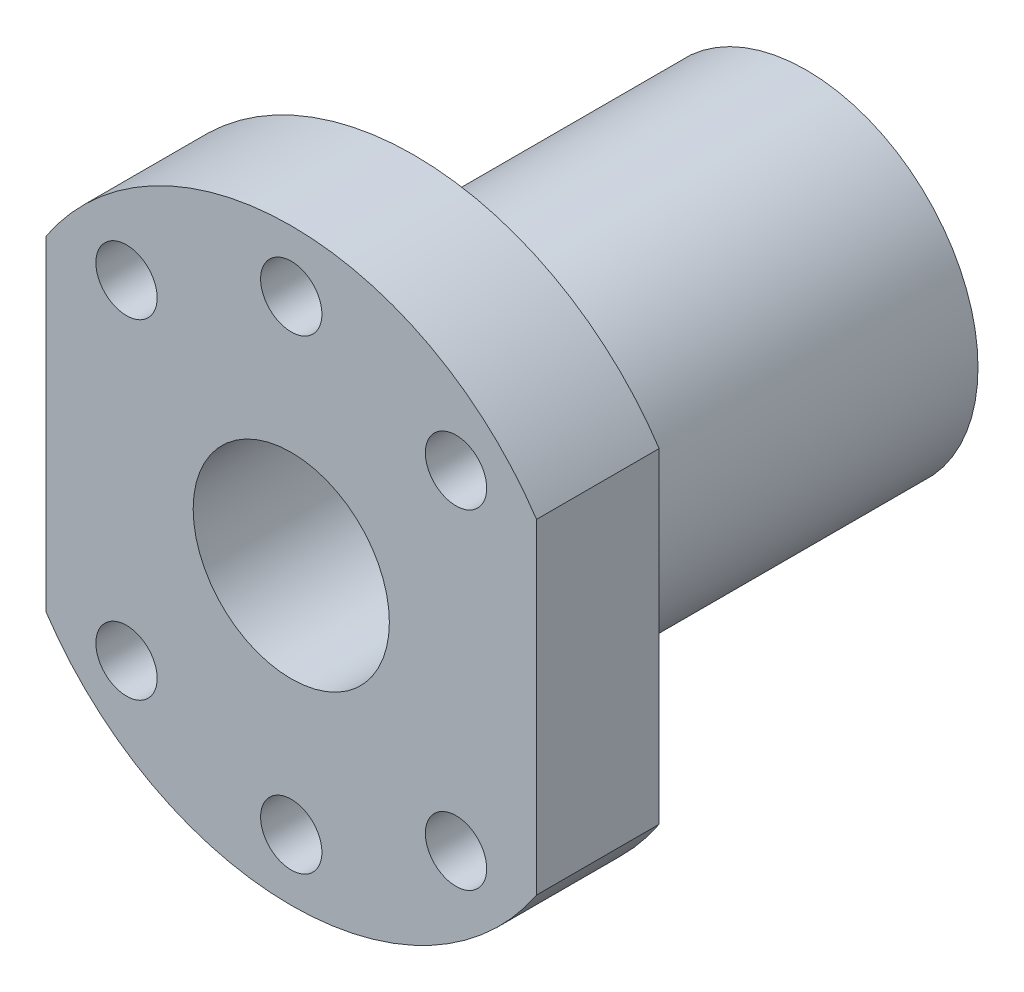
ISO-10303-21;
HEADER;
FILE_DESCRIPTION(('STEP AP214'),'2;1');
FILE_NAME('part.step','',(''),(''),'','','');
FILE_SCHEMA(('AUTOMOTIVE_DESIGN { 1 0 10303 214 1 1 1 1 }'));
ENDSEC;
DATA;
#1=APPLICATION_CONTEXT('core data for automotive mechanical design processes');
#2=APPLICATION_PROTOCOL_DEFINITION('international standard','automotive_design',2000,#1);
#3=PRODUCT_CONTEXT('',#1,'mechanical');
#4=PRODUCT('Part','Part','',(#3));
#5=PRODUCT_RELATED_PRODUCT_CATEGORY('part','',(#4));
#6=PRODUCT_DEFINITION_FORMATION('','',#4);
#7=PRODUCT_DEFINITION_CONTEXT('part definition',#1,'design');
#8=PRODUCT_DEFINITION('design','',#6,#7);
#9=PRODUCT_DEFINITION_SHAPE('','',#8);
#10=(LENGTH_UNIT() NAMED_UNIT(*) SI_UNIT(.MILLI.,.METRE.));
#11=(NAMED_UNIT(*) PLANE_ANGLE_UNIT() SI_UNIT($,.RADIAN.));
#12=(NAMED_UNIT(*) SI_UNIT($,.STERADIAN.) SOLID_ANGLE_UNIT());
#13=UNCERTAINTY_MEASURE_WITH_UNIT(LENGTH_MEASURE(1.E-05),#10,'distance_accuracy_value','');
#14=(GEOMETRIC_REPRESENTATION_CONTEXT(3) GLOBAL_UNCERTAINTY_ASSIGNED_CONTEXT((#13)) GLOBAL_UNIT_ASSIGNED_CONTEXT((#10,
#11,#12)) REPRESENTATION_CONTEXT('',''));
#15=CARTESIAN_POINT('',(0.,0.,0.));
#16=DIRECTION('',(0.,0.,1.));
#17=DIRECTION('',(1.,0.,0.));
#18=AXIS2_PLACEMENT_3D('',#15,#16,#17);
#19=CARTESIAN_POINT('',(0.,0.,0.));
#20=DIRECTION('',(0.,0.,1.));
#21=DIRECTION('',(1.,0.,0.));
#22=AXIS2_PLACEMENT_3D('',#19,#20,#21);
#23=PLANE('',#22);
#24=CARTESIAN_POINT('',(-13.4350288425442,13.4350288425446,0.));
#25=DIRECTION('',(0.,0.,1.));
#26=DIRECTION('',(1.,0.,0.));
#27=AXIS2_PLACEMENT_3D('',#24,#25,#26);
#28=CIRCLE('',#27,2.49999999999999);
#29=CARTESIAN_POINT('',(-10.9350288425442,13.4350288425446,0.));
#30=VERTEX_POINT('',#29);
#31=EDGE_CURVE('E265',#30,#30,#28,.T.);
#32=ORIENTED_EDGE('',*,*,#31,.T.);
#33=EDGE_LOOP('',(#32));
#34=FACE_BOUND('',#33,.T.);
#35=CARTESIAN_POINT('',(-13.4350288425445,-13.4350288425443,0.));
#36=DIRECTION('',(0.,0.,1.));
#37=DIRECTION('',(1.,0.,0.));
#38=AXIS2_PLACEMENT_3D('',#35,#36,#37);
#39=CIRCLE('',#38,2.49999999999999);
#40=CARTESIAN_POINT('',(-10.9350288425445,-13.4350288425443,0.));
#41=VERTEX_POINT('',#40);
#42=EDGE_CURVE('E259',#41,#41,#39,.T.);
#43=ORIENTED_EDGE('',*,*,#42,.T.);
#44=EDGE_LOOP('',(#43));
#45=FACE_BOUND('',#44,.T.);
#46=CARTESIAN_POINT('',(0.,-19.,0.));
#47=DIRECTION('',(0.,0.,1.));
#48=DIRECTION('',(1.,0.,0.));
#49=AXIS2_PLACEMENT_3D('',#46,#47,#48);
#50=CIRCLE('',#49,2.49999999999999);
#51=CARTESIAN_POINT('',(2.49999999999999,-19.,0.));
#52=VERTEX_POINT('',#51);
#53=EDGE_CURVE('E253',#52,#52,#50,.T.);
#54=ORIENTED_EDGE('',*,*,#53,.T.);
#55=EDGE_LOOP('',(#54));
#56=FACE_BOUND('',#55,.T.);
#57=CARTESIAN_POINT('',(13.4350288425443,-13.4350288425445,0.));
#58=DIRECTION('',(0.,0.,1.));
#59=DIRECTION('',(1.,0.,0.));
#60=AXIS2_PLACEMENT_3D('',#57,#58,#59);
#61=CIRCLE('',#60,2.49999999999999);
#62=CARTESIAN_POINT('',(15.9350288425443,-13.4350288425445,0.));
#63=VERTEX_POINT('',#62);
#64=EDGE_CURVE('E37',#63,#63,#61,.T.);
#65=ORIENTED_EDGE('',*,*,#64,.T.);
#66=EDGE_LOOP('',(#65));
#67=FACE_BOUND('',#66,.T.);
#68=CARTESIAN_POINT('',(13.4350288425444,13.4350288425444,0.));
#69=DIRECTION('',(0.,0.,1.));
#70=DIRECTION('',(1.,0.,0.));
#71=AXIS2_PLACEMENT_3D('',#68,#69,#70);
#72=CIRCLE('',#71,2.49999999999999);
#73=CARTESIAN_POINT('',(15.9350288425444,13.4350288425444,0.));
#74=VERTEX_POINT('',#73);
#75=EDGE_CURVE('E244',#74,#74,#72,.T.);
#76=ORIENTED_EDGE('',*,*,#75,.T.);
#77=EDGE_LOOP('',(#76));
#78=FACE_BOUND('',#77,.T.);
#79=CARTESIAN_POINT('',(0.,19.,0.));
#80=DIRECTION('',(0.,0.,1.));
#81=DIRECTION('',(1.,0.,0.));
#82=AXIS2_PLACEMENT_3D('',#79,#80,#81);
#83=CIRCLE('',#82,2.49999999999999);
#84=CARTESIAN_POINT('',(2.49999999999999,19.,0.));
#85=VERTEX_POINT('',#84);
#86=EDGE_CURVE('E232',#85,#85,#83,.T.);
#87=ORIENTED_EDGE('',*,*,#86,.T.);
#88=EDGE_LOOP('',(#87));
#89=FACE_BOUND('',#88,.T.);
#90=CARTESIAN_POINT('',(0.,0.,0.));
#91=DIRECTION('',(0.,0.,1.));
#92=DIRECTION('',(1.,0.,0.));
#93=AXIS2_PLACEMENT_3D('',#90,#91,#92);
#94=CIRCLE('',#93,24.);
#95=CARTESIAN_POINT('',(-20.,-13.2664991614216,0.));
#96=VERTEX_POINT('',#95);
#97=CARTESIAN_POINT('',(20.,-13.2664991614216,0.));
#98=VERTEX_POINT('',#97);
#99=EDGE_CURVE('E101',#96,#98,#94,.T.);
#100=ORIENTED_EDGE('',*,*,#99,.F.);
#101=DIRECTION('',(0.,-1.,0.));
#102=VECTOR('',#101,1.);
#103=CARTESIAN_POINT('',(-20.,13.2664991614216,0.));
#104=LINE('',#103,#102);
#105=CARTESIAN_POINT('',(-20.,13.2664991614216,0.));
#106=VERTEX_POINT('',#105);
#107=EDGE_CURVE('E74',#106,#96,#104,.T.);
#108=ORIENTED_EDGE('',*,*,#107,.F.);
#109=CARTESIAN_POINT('',(0.,0.,0.));
#110=DIRECTION('',(0.,0.,1.));
#111=DIRECTION('',(1.,0.,0.));
#112=AXIS2_PLACEMENT_3D('',#109,#110,#111);
#113=CIRCLE('',#112,24.);
#114=CARTESIAN_POINT('',(20.,13.2664991614216,0.));
#115=VERTEX_POINT('',#114);
#116=EDGE_CURVE('E68',#115,#106,#113,.T.);
#117=ORIENTED_EDGE('',*,*,#116,.F.);
#118=DIRECTION('',(0.,1.,0.));
#119=VECTOR('',#118,1.);
#120=CARTESIAN_POINT('',(20.,13.2664991614216,0.));
#121=LINE('',#120,#119);
#122=EDGE_CURVE('E92',#98,#115,#121,.T.);
#123=ORIENTED_EDGE('',*,*,#122,.F.);
#124=EDGE_LOOP('',(#100,#108,#117,#123));
#125=FACE_BOUND('',#124,.T.);
#126=CARTESIAN_POINT('',(0.,0.,0.));
#127=DIRECTION('',(0.,0.,1.));
#128=DIRECTION('',(1.,0.,0.));
#129=AXIS2_PLACEMENT_3D('',#126,#127,#128);
#130=CIRCLE('',#129,14.);
#131=CARTESIAN_POINT('',(14.,0.,0.));
#132=VERTEX_POINT('',#131);
#133=EDGE_CURVE('E11',#132,#132,#130,.F.);
#134=ORIENTED_EDGE('',*,*,#133,.F.);
#135=EDGE_LOOP('',(#134));
#136=FACE_BOUND('',#135,.T.);
#137=ADVANCED_FACE('F33',(#34,#45,#56,#67,#78,#89,#125,#136),#23,.F.);
#138=CARTESIAN_POINT('',(0.,0.,10.));
#139=DIRECTION('',(0.,0.,-1.));
#140=DIRECTION('',(-1.,0.,0.));
#141=AXIS2_PLACEMENT_3D('',#138,#139,#140);
#142=CYLINDRICAL_SURFACE('',#141,24.);
#143=ORIENTED_EDGE('',*,*,#99,.T.);
#144=DIRECTION('',(0.,0.,-1.));
#145=VECTOR('',#144,1.);
#146=CARTESIAN_POINT('',(20.,-13.2664991614216,10.));
#147=LINE('',#146,#145);
#148=CARTESIAN_POINT('',(20.,-13.2664991614216,10.));
#149=VERTEX_POINT('',#148);
#150=EDGE_CURVE('E43',#149,#98,#147,.T.);
#151=ORIENTED_EDGE('',*,*,#150,.F.);
#152=CARTESIAN_POINT('',(0.,0.,10.));
#153=DIRECTION('',(0.,0.,1.));
#154=DIRECTION('',(1.,0.,0.));
#155=AXIS2_PLACEMENT_3D('',#152,#153,#154);
#156=CIRCLE('',#155,24.);
#157=CARTESIAN_POINT('',(-20.,-13.2664991614216,10.));
#158=VERTEX_POINT('',#157);
#159=EDGE_CURVE('E87',#158,#149,#156,.T.);
#160=ORIENTED_EDGE('',*,*,#159,.F.);
#161=DIRECTION('',(0.,0.,-1.));
#162=VECTOR('',#161,1.);
#163=CARTESIAN_POINT('',(-20.,-13.2664991614216,10.));
#164=LINE('',#163,#162);
#165=EDGE_CURVE('E97',#158,#96,#164,.T.);
#166=ORIENTED_EDGE('',*,*,#165,.T.);
#167=EDGE_LOOP('',(#143,#151,#160,#166));
#168=FACE_BOUND('',#167,.T.);
#169=ADVANCED_FACE('F35',(#168),#142,.T.);
#170=CARTESIAN_POINT('',(20.,13.2664991614216,10.));
#171=DIRECTION('',(-1.,0.,0.));
#172=DIRECTION('',(0.,-1.,0.));
#173=AXIS2_PLACEMENT_3D('',#170,#171,#172);
#174=PLANE('',#173);
#175=ORIENTED_EDGE('',*,*,#122,.T.);
#176=DIRECTION('',(0.,0.,-1.));
#177=VECTOR('',#176,1.);
#178=CARTESIAN_POINT('',(20.,13.2664991614216,10.));
#179=LINE('',#178,#177);
#180=CARTESIAN_POINT('',(20.,13.2664991614216,10.));
#181=VERTEX_POINT('',#180);
#182=EDGE_CURVE('E90',#181,#115,#179,.T.);
#183=ORIENTED_EDGE('',*,*,#182,.F.);
#184=DIRECTION('',(0.,1.,0.));
#185=VECTOR('',#184,1.);
#186=CARTESIAN_POINT('',(20.,13.2664991614216,10.));
#187=LINE('',#186,#185);
#188=EDGE_CURVE('E82',#149,#181,#187,.T.);
#189=ORIENTED_EDGE('',*,*,#188,.F.);
#190=ORIENTED_EDGE('',*,*,#150,.T.);
#191=EDGE_LOOP('',(#175,#183,#189,#190));
#192=FACE_BOUND('',#191,.T.);
#193=ADVANCED_FACE('F91',(#192),#174,.F.);
#194=CARTESIAN_POINT('',(0.,0.,10.));
#195=DIRECTION('',(0.,0.,-1.));
#196=DIRECTION('',(-1.,0.,0.));
#197=AXIS2_PLACEMENT_3D('',#194,#195,#196);
#198=CYLINDRICAL_SURFACE('',#197,24.);
#199=ORIENTED_EDGE('',*,*,#116,.T.);
#200=DIRECTION('',(0.,0.,-1.));
#201=VECTOR('',#200,1.);
#202=CARTESIAN_POINT('',(-20.,13.2664991614216,10.));
#203=LINE('',#202,#201);
#204=CARTESIAN_POINT('',(-20.,13.2664991614216,10.));
#205=VERTEX_POINT('',#204);
#206=EDGE_CURVE('E93',#205,#106,#203,.T.);
#207=ORIENTED_EDGE('',*,*,#206,.F.);
#208=CARTESIAN_POINT('',(0.,0.,10.));
#209=DIRECTION('',(0.,0.,1.));
#210=DIRECTION('',(1.,0.,0.));
#211=AXIS2_PLACEMENT_3D('',#208,#209,#210);
#212=CIRCLE('',#211,24.);
#213=EDGE_CURVE('E85',#181,#205,#212,.T.);
#214=ORIENTED_EDGE('',*,*,#213,.F.);
#215=ORIENTED_EDGE('',*,*,#182,.T.);
#216=EDGE_LOOP('',(#199,#207,#214,#215));
#217=FACE_BOUND('',#216,.T.);
#218=ADVANCED_FACE('F95',(#217),#198,.T.);
#219=CARTESIAN_POINT('',(-20.,13.2664991614216,10.));
#220=DIRECTION('',(1.,0.,0.));
#221=DIRECTION('',(0.,1.,0.));
#222=AXIS2_PLACEMENT_3D('',#219,#220,#221);
#223=PLANE('',#222);
#224=ORIENTED_EDGE('',*,*,#107,.T.);
#225=ORIENTED_EDGE('',*,*,#165,.F.);
#226=DIRECTION('',(0.,-1.,0.));
#227=VECTOR('',#226,1.);
#228=CARTESIAN_POINT('',(-20.,13.2664991614216,10.));
#229=LINE('',#228,#227);
#230=EDGE_CURVE('E51',#205,#158,#229,.T.);
#231=ORIENTED_EDGE('',*,*,#230,.F.);
#232=ORIENTED_EDGE('',*,*,#206,.T.);
#233=EDGE_LOOP('',(#224,#225,#231,#232));
#234=FACE_BOUND('',#233,.T.);
#235=ADVANCED_FACE('F131',(#234),#223,.F.);
#236=CARTESIAN_POINT('',(0.,0.,10.));
#237=DIRECTION('',(0.,0.,1.));
#238=DIRECTION('',(1.,0.,0.));
#239=AXIS2_PLACEMENT_3D('',#236,#237,#238);
#240=PLANE('',#239);
#241=CARTESIAN_POINT('',(-13.4350288425442,13.4350288425446,10.));
#242=DIRECTION('',(0.,0.,1.));
#243=DIRECTION('',(1.,0.,0.));
#244=AXIS2_PLACEMENT_3D('',#241,#242,#243);
#245=CIRCLE('',#244,2.49999999999999);
#246=CARTESIAN_POINT('',(-10.9350288425443,13.4350288425446,10.));
#247=VERTEX_POINT('',#246);
#248=EDGE_CURVE('E268',#247,#247,#245,.T.);
#249=ORIENTED_EDGE('',*,*,#248,.F.);
#250=EDGE_LOOP('',(#249));
#251=FACE_BOUND('',#250,.T.);
#252=CARTESIAN_POINT('',(-13.4350288425445,-13.4350288425443,10.));
#253=DIRECTION('',(0.,0.,1.));
#254=DIRECTION('',(1.,0.,0.));
#255=AXIS2_PLACEMENT_3D('',#252,#253,#254);
#256=CIRCLE('',#255,2.49999999999999);
#257=CARTESIAN_POINT('',(-10.9350288425445,-13.4350288425443,10.));
#258=VERTEX_POINT('',#257);
#259=EDGE_CURVE('E262',#258,#258,#256,.T.);
#260=ORIENTED_EDGE('',*,*,#259,.F.);
#261=EDGE_LOOP('',(#260));
#262=FACE_BOUND('',#261,.T.);
#263=CARTESIAN_POINT('',(0.,-19.,10.));
#264=DIRECTION('',(0.,0.,1.));
#265=DIRECTION('',(1.,0.,0.));
#266=AXIS2_PLACEMENT_3D('',#263,#264,#265);
#267=CIRCLE('',#266,2.49999999999999);
#268=CARTESIAN_POINT('',(2.49999999999999,-19.,10.));
#269=VERTEX_POINT('',#268);
#270=EDGE_CURVE('E256',#269,#269,#267,.T.);
#271=ORIENTED_EDGE('',*,*,#270,.F.);
#272=EDGE_LOOP('',(#271));
#273=FACE_BOUND('',#272,.T.);
#274=CARTESIAN_POINT('',(13.4350288425443,-13.4350288425445,10.));
#275=DIRECTION('',(0.,0.,1.));
#276=DIRECTION('',(1.,0.,0.));
#277=AXIS2_PLACEMENT_3D('',#274,#275,#276);
#278=CIRCLE('',#277,2.49999999999999);
#279=CARTESIAN_POINT('',(15.9350288425443,-13.4350288425445,10.));
#280=VERTEX_POINT('',#279);
#281=EDGE_CURVE('E250',#280,#280,#278,.T.);
#282=ORIENTED_EDGE('',*,*,#281,.F.);
#283=EDGE_LOOP('',(#282));
#284=FACE_BOUND('',#283,.T.);
#285=CARTESIAN_POINT('',(13.4350288425444,13.4350288425444,10.));
#286=DIRECTION('',(0.,0.,1.));
#287=DIRECTION('',(1.,0.,0.));
#288=AXIS2_PLACEMENT_3D('',#285,#286,#287);
#289=CIRCLE('',#288,2.49999999999999);
#290=CARTESIAN_POINT('',(15.9350288425444,13.4350288425444,10.));
#291=VERTEX_POINT('',#290);
#292=EDGE_CURVE('E247',#291,#291,#289,.T.);
#293=ORIENTED_EDGE('',*,*,#292,.F.);
#294=EDGE_LOOP('',(#293));
#295=FACE_BOUND('',#294,.T.);
#296=CARTESIAN_POINT('',(0.,19.,10.));
#297=DIRECTION('',(0.,0.,1.));
#298=DIRECTION('',(1.,0.,0.));
#299=AXIS2_PLACEMENT_3D('',#296,#297,#298);
#300=CIRCLE('',#299,2.49999999999999);
#301=CARTESIAN_POINT('',(2.49999999999999,19.,10.));
#302=VERTEX_POINT('',#301);
#303=EDGE_CURVE('E236',#302,#302,#300,.T.);
#304=ORIENTED_EDGE('',*,*,#303,.F.);
#305=EDGE_LOOP('',(#304));
#306=FACE_BOUND('',#305,.T.);
#307=CARTESIAN_POINT('',(0.,0.,10.));
#308=DIRECTION('',(0.,0.,-1.));
#309=DIRECTION('',(-1.,0.,0.));
#310=AXIS2_PLACEMENT_3D('',#307,#308,#309);
#311=CIRCLE('',#310,8.);
#312=CARTESIAN_POINT('',(-8.,0.,10.));
#313=VERTEX_POINT('',#312);
#314=EDGE_CURVE('E228',#313,#313,#311,.T.);
#315=ORIENTED_EDGE('',*,*,#314,.T.);
#316=EDGE_LOOP('',(#315));
#317=FACE_BOUND('',#316,.T.);
#318=ORIENTED_EDGE('',*,*,#159,.T.);
#319=ORIENTED_EDGE('',*,*,#188,.T.);
#320=ORIENTED_EDGE('',*,*,#213,.T.);
#321=ORIENTED_EDGE('',*,*,#230,.T.);
#322=EDGE_LOOP('',(#318,#319,#320,#321));
#323=FACE_BOUND('',#322,.T.);
#324=ADVANCED_FACE('F83',(#251,#262,#273,#284,#295,#306,#317,#323),#240,.T.);
#325=CARTESIAN_POINT('',(0.,0.,-32.));
#326=DIRECTION('',(0.,0.,1.));
#327=DIRECTION('',(1.,0.,0.));
#328=AXIS2_PLACEMENT_3D('',#325,#326,#327);
#329=CYLINDRICAL_SURFACE('',#328,14.);
#330=CARTESIAN_POINT('',(0.,0.,-32.));
#331=DIRECTION('',(0.,0.,-1.));
#332=DIRECTION('',(-1.,0.,0.));
#333=AXIS2_PLACEMENT_3D('',#330,#331,#332);
#334=CIRCLE('',#333,14.);
#335=CARTESIAN_POINT('',(-14.,0.,-32.));
#336=VERTEX_POINT('',#335);
#337=EDGE_CURVE('E104',#336,#336,#334,.T.);
#338=ORIENTED_EDGE('',*,*,#337,.F.);
#339=EDGE_LOOP('',(#338));
#340=FACE_BOUND('',#339,.T.);
#341=ORIENTED_EDGE('',*,*,#133,.T.);
#342=EDGE_LOOP('',(#341));
#343=FACE_BOUND('',#342,.T.);
#344=ADVANCED_FACE('F119',(#340,#343),#329,.T.);
#345=CARTESIAN_POINT('',(0.,0.,-32.));
#346=DIRECTION('',(0.,0.,-1.));
#347=DIRECTION('',(-1.,0.,0.));
#348=AXIS2_PLACEMENT_3D('',#345,#346,#347);
#349=PLANE('',#348);
#350=CARTESIAN_POINT('',(0.,0.,-32.));
#351=DIRECTION('',(0.,0.,-1.));
#352=DIRECTION('',(-1.,0.,0.));
#353=AXIS2_PLACEMENT_3D('',#350,#351,#352);
#354=CIRCLE('',#353,8.);
#355=CARTESIAN_POINT('',(-8.,0.,-32.));
#356=VERTEX_POINT('',#355);
#357=EDGE_CURVE('E231',#356,#356,#354,.T.);
#358=ORIENTED_EDGE('',*,*,#357,.F.);
#359=EDGE_LOOP('',(#358));
#360=FACE_BOUND('',#359,.T.);
#361=ORIENTED_EDGE('',*,*,#337,.T.);
#362=EDGE_LOOP('',(#361));
#363=FACE_BOUND('',#362,.T.);
#364=ADVANCED_FACE('F121',(#360,#363),#349,.T.);
#365=CARTESIAN_POINT('',(0.,0.,10.));
#366=DIRECTION('',(0.,0.,-1.));
#367=DIRECTION('',(-1.,0.,0.));
#368=AXIS2_PLACEMENT_3D('',#365,#366,#367);
#369=CYLINDRICAL_SURFACE('',#368,8.);
#370=CARTESIAN_POINT('',(-8.,0.,10.));
#371=CARTESIAN_POINT('',(-8.,0.,9.5625));
#372=CARTESIAN_POINT('',(-8.,0.,9.125));
#373=CARTESIAN_POINT('',(-8.,0.,8.25));
#374=CARTESIAN_POINT('',(-8.,0.,7.8125));
#375=CARTESIAN_POINT('',(-8.,0.,6.9375));
#376=CARTESIAN_POINT('',(-8.,0.,6.5));
#377=CARTESIAN_POINT('',(-8.,0.,5.625));
#378=CARTESIAN_POINT('',(-8.,0.,5.1875));
#379=CARTESIAN_POINT('',(-8.,0.,4.3125));
#380=CARTESIAN_POINT('',(-8.,0.,3.875));
#381=CARTESIAN_POINT('',(-8.,0.,3.));
#382=CARTESIAN_POINT('',(-8.,0.,2.5625));
#383=CARTESIAN_POINT('',(-8.,0.,1.6875));
#384=CARTESIAN_POINT('',(-8.,0.,1.25));
#385=CARTESIAN_POINT('',(-8.,0.,0.375000000000004));
#386=CARTESIAN_POINT('',(-8.,0.,-0.0624999999999966));
#387=CARTESIAN_POINT('',(-8.,0.,-0.937499999999997));
#388=CARTESIAN_POINT('',(-8.,0.,-1.375));
#389=CARTESIAN_POINT('',(-8.,0.,-2.25));
#390=CARTESIAN_POINT('',(-8.,0.,-2.6875));
#391=CARTESIAN_POINT('',(-8.,0.,-3.5625));
#392=CARTESIAN_POINT('',(-8.,0.,-4.));
#393=CARTESIAN_POINT('',(-8.,0.,-4.875));
#394=CARTESIAN_POINT('',(-8.,0.,-5.3125));
#395=CARTESIAN_POINT('',(-8.,0.,-6.1875));
#396=CARTESIAN_POINT('',(-8.,0.,-6.625));
#397=CARTESIAN_POINT('',(-8.,0.,-7.5));
#398=CARTESIAN_POINT('',(-8.,0.,-7.9375));
#399=CARTESIAN_POINT('',(-8.,0.,-8.8125));
#400=CARTESIAN_POINT('',(-8.,0.,-9.25));
#401=CARTESIAN_POINT('',(-8.,0.,-10.125));
#402=CARTESIAN_POINT('',(-8.,0.,-10.5625));
#403=CARTESIAN_POINT('',(-8.,0.,-11.4375));
#404=CARTESIAN_POINT('',(-8.,0.,-11.875));
#405=CARTESIAN_POINT('',(-8.,0.,-12.75));
#406=CARTESIAN_POINT('',(-8.,0.,-13.1875));
#407=CARTESIAN_POINT('',(-8.,0.,-14.0625));
#408=CARTESIAN_POINT('',(-8.,0.,-14.5));
#409=CARTESIAN_POINT('',(-8.,0.,-15.375));
#410=CARTESIAN_POINT('',(-8.,0.,-15.8125));
#411=CARTESIAN_POINT('',(-8.,0.,-16.6875));
#412=CARTESIAN_POINT('',(-8.,0.,-17.125));
#413=CARTESIAN_POINT('',(-8.,0.,-18.));
#414=CARTESIAN_POINT('',(-8.,0.,-18.4375));
#415=CARTESIAN_POINT('',(-8.,0.,-19.3125));
#416=CARTESIAN_POINT('',(-8.,0.,-19.75));
#417=CARTESIAN_POINT('',(-8.,0.,-20.625));
#418=CARTESIAN_POINT('',(-8.,0.,-21.0625));
#419=CARTESIAN_POINT('',(-8.,0.,-21.9375));
#420=CARTESIAN_POINT('',(-8.,0.,-22.375));
#421=CARTESIAN_POINT('',(-8.,0.,-23.25));
#422=CARTESIAN_POINT('',(-8.,0.,-23.6875));
#423=CARTESIAN_POINT('',(-8.,0.,-24.5625));
#424=CARTESIAN_POINT('',(-8.,0.,-25.));
#425=CARTESIAN_POINT('',(-8.,0.,-25.875));
#426=CARTESIAN_POINT('',(-8.,0.,-26.3125));
#427=CARTESIAN_POINT('',(-8.,0.,-27.1875));
#428=CARTESIAN_POINT('',(-8.,0.,-27.625));
#429=CARTESIAN_POINT('',(-8.,0.,-28.5));
#430=CARTESIAN_POINT('',(-8.,0.,-28.9375));
#431=CARTESIAN_POINT('',(-8.,0.,-29.8125));
#432=CARTESIAN_POINT('',(-8.,0.,-30.25));
#433=CARTESIAN_POINT('',(-8.,0.,-31.125));
#434=CARTESIAN_POINT('',(-8.,0.,-31.5625));
#435=CARTESIAN_POINT('',(-8.,0.,-32.));
#436=B_SPLINE_CURVE_WITH_KNOTS('',3,(#370,#371,#372,#373,#374,#375,#376,#377,#378,#379,#380,
#381,#382,#383,#384,#385,#386,#387,#388,#389,#390,#391,#392,#393,#394,#395,#396,#397,#398,#399,
#400,#401,#402,#403,#404,#405,#406,#407,#408,#409,#410,#411,#412,#413,#414,#415,#416,#417,#418,
#419,#420,#421,#422,#423,#424,#425,#426,#427,#428,#429,#430,#431,#432,#433,#434,#435),
.UNSPECIFIED.,.F.,.F.,(4,2,2,2,2,2,2,2,2,2,2,2,2,2,2,2,2,2,2,2,2,2,2,2,2,2,2,2,2,2,2,2,4),(0.,
1.3125,2.625,3.9375,5.25,6.5625,7.875,9.1875,10.5,11.8125,13.125,14.4375,15.75,17.0625,18.375,
19.6875,21.,22.3125,23.625,24.9375,26.25,27.5625,28.875,30.1875,31.5,32.8125,34.125,35.4375,
36.75,38.0625,39.375,40.6875,42.),.UNSPECIFIED.);
#437=EDGE_CURVE('BSEAM128',#313,#356,#436,.T.);
#438=ORIENTED_EDGE('',*,*,#314,.F.);
#439=ORIENTED_EDGE('',*,*,#357,.T.);
#440=ORIENTED_EDGE('',*,*,#437,.T.);
#441=ORIENTED_EDGE('',*,*,#437,.F.);
#442=EDGE_LOOP('',(#438,#440,#439,#441));
#443=FACE_BOUND('',#442,.T.);
#444=ADVANCED_FACE('F128',(#443),#369,.F.);
#445=CARTESIAN_POINT('',(0.,19.,10.));
#446=DIRECTION('',(0.,0.,1.));
#447=DIRECTION('',(1.,0.,0.));
#448=AXIS2_PLACEMENT_3D('',#445,#446,#447);
#449=CYLINDRICAL_SURFACE('',#448,2.49999999999999);
#450=ORIENTED_EDGE('',*,*,#303,.T.);
#451=EDGE_LOOP('',(#450));
#452=FACE_BOUND('',#451,.T.);
#453=ORIENTED_EDGE('',*,*,#86,.F.);
#454=EDGE_LOOP('',(#453));
#455=FACE_BOUND('',#454,.T.);
#456=ADVANCED_FACE('F158',(#452,#455),#449,.F.);
#457=CARTESIAN_POINT('',(13.4350288425444,13.4350288425444,10.));
#458=DIRECTION('',(0.,0.,1.));
#459=DIRECTION('',(1.,0.,0.));
#460=AXIS2_PLACEMENT_3D('',#457,#458,#459);
#461=CYLINDRICAL_SURFACE('',#460,2.49999999999999);
#462=ORIENTED_EDGE('',*,*,#292,.T.);
#463=EDGE_LOOP('',(#462));
#464=FACE_BOUND('',#463,.T.);
#465=ORIENTED_EDGE('',*,*,#75,.F.);
#466=EDGE_LOOP('',(#465));
#467=FACE_BOUND('',#466,.T.);
#468=ADVANCED_FACE('F169',(#464,#467),#461,.F.);
#469=CARTESIAN_POINT('',(13.4350288425443,-13.4350288425445,10.));
#470=DIRECTION('',(0.,0.,1.));
#471=DIRECTION('',(1.,0.,0.));
#472=AXIS2_PLACEMENT_3D('',#469,#470,#471);
#473=CYLINDRICAL_SURFACE('',#472,2.49999999999999);
#474=ORIENTED_EDGE('',*,*,#281,.T.);
#475=EDGE_LOOP('',(#474));
#476=FACE_BOUND('',#475,.T.);
#477=ORIENTED_EDGE('',*,*,#64,.F.);
#478=EDGE_LOOP('',(#477));
#479=FACE_BOUND('',#478,.T.);
#480=ADVANCED_FACE('F174',(#476,#479),#473,.F.);
#481=CARTESIAN_POINT('',(0.,-19.,10.));
#482=DIRECTION('',(0.,0.,1.));
#483=DIRECTION('',(1.,0.,0.));
#484=AXIS2_PLACEMENT_3D('',#481,#482,#483);
#485=CYLINDRICAL_SURFACE('',#484,2.49999999999999);
#486=ORIENTED_EDGE('',*,*,#270,.T.);
#487=EDGE_LOOP('',(#486));
#488=FACE_BOUND('',#487,.T.);
#489=ORIENTED_EDGE('',*,*,#53,.F.);
#490=EDGE_LOOP('',(#489));
#491=FACE_BOUND('',#490,.T.);
#492=ADVANCED_FACE('F184',(#488,#491),#485,.F.);
#493=CARTESIAN_POINT('',(-13.4350288425445,-13.4350288425443,10.));
#494=DIRECTION('',(0.,0.,1.));
#495=DIRECTION('',(1.,0.,0.));
#496=AXIS2_PLACEMENT_3D('',#493,#494,#495);
#497=CYLINDRICAL_SURFACE('',#496,2.49999999999999);
#498=ORIENTED_EDGE('',*,*,#259,.T.);
#499=EDGE_LOOP('',(#498));
#500=FACE_BOUND('',#499,.T.);
#501=ORIENTED_EDGE('',*,*,#42,.F.);
#502=EDGE_LOOP('',(#501));
#503=FACE_BOUND('',#502,.T.);
#504=ADVANCED_FACE('F194',(#500,#503),#497,.F.);
#505=CARTESIAN_POINT('',(-13.4350288425442,13.4350288425446,10.));
#506=DIRECTION('',(0.,0.,1.));
#507=DIRECTION('',(1.,0.,0.));
#508=AXIS2_PLACEMENT_3D('',#505,#506,#507);
#509=CYLINDRICAL_SURFACE('',#508,2.49999999999999);
#510=ORIENTED_EDGE('',*,*,#248,.T.);
#511=EDGE_LOOP('',(#510));
#512=FACE_BOUND('',#511,.T.);
#513=ORIENTED_EDGE('',*,*,#31,.F.);
#514=EDGE_LOOP('',(#513));
#515=FACE_BOUND('',#514,.T.);
#516=ADVANCED_FACE('F204',(#512,#515),#509,.F.);
#517=CLOSED_SHELL('',(#137,#169,#193,#218,#235,#324,#344,#364,#444,#456,#468,#480,#492,#504,#516));
#518=MANIFOLD_SOLID_BREP('B2',#517);
#519=ADVANCED_BREP_SHAPE_REPRESENTATION('',(#18,#518),#14);
#520=SHAPE_DEFINITION_REPRESENTATION(#9,#519);
ENDSEC;
END-ISO-10303-21;
